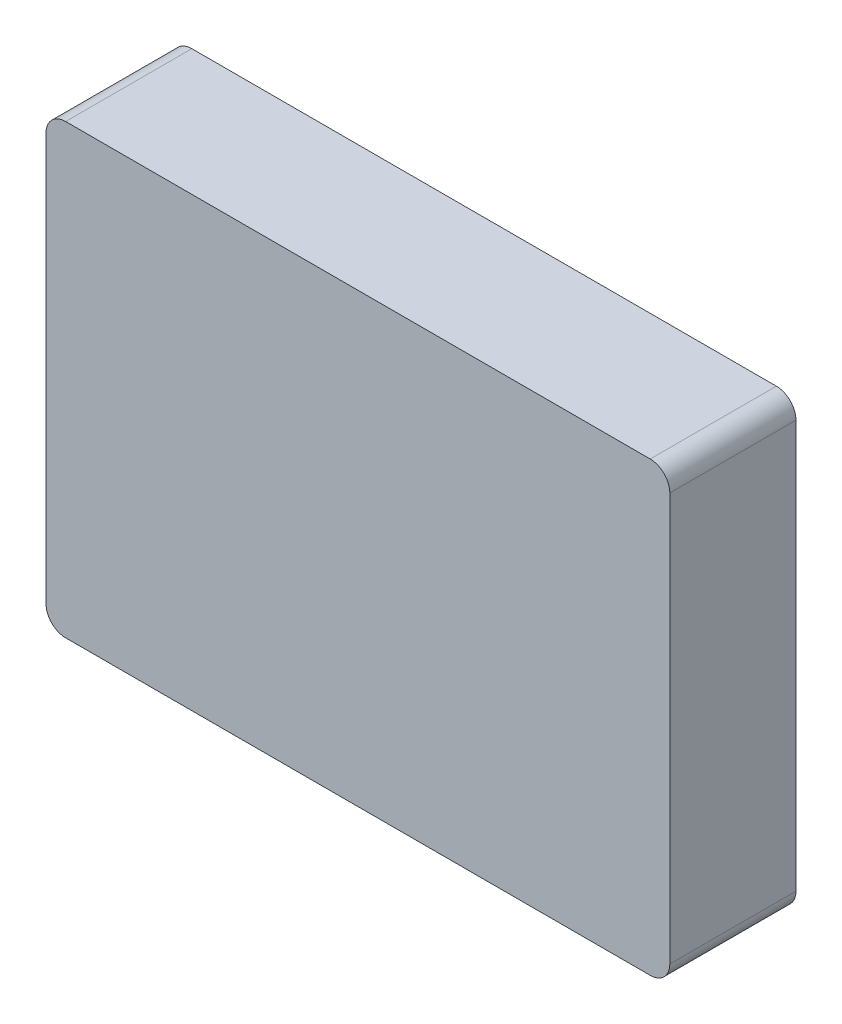
ISO-10303-21;
HEADER;
FILE_DESCRIPTION(('STEP AP214'),'2;1');
FILE_NAME('part.step','',(''),(''),'','','');
FILE_SCHEMA(('AUTOMOTIVE_DESIGN { 1 0 10303 214 1 1 1 1 }'));
ENDSEC;
DATA;
#1=APPLICATION_CONTEXT('core data for automotive mechanical design processes');
#2=APPLICATION_PROTOCOL_DEFINITION('international standard','automotive_design',2000,#1);
#3=PRODUCT_CONTEXT('',#1,'mechanical');
#4=PRODUCT('Part','Part','',(#3));
#5=PRODUCT_RELATED_PRODUCT_CATEGORY('part','',(#4));
#6=PRODUCT_DEFINITION_FORMATION('','',#4);
#7=PRODUCT_DEFINITION_CONTEXT('part definition',#1,'design');
#8=PRODUCT_DEFINITION('design','',#6,#7);
#9=PRODUCT_DEFINITION_SHAPE('','',#8);
#10=(LENGTH_UNIT() NAMED_UNIT(*) SI_UNIT(.MILLI.,.METRE.));
#11=(NAMED_UNIT(*) PLANE_ANGLE_UNIT() SI_UNIT($,.RADIAN.));
#12=(NAMED_UNIT(*) SI_UNIT($,.STERADIAN.) SOLID_ANGLE_UNIT());
#13=UNCERTAINTY_MEASURE_WITH_UNIT(LENGTH_MEASURE(1.E-05),#10,'distance_accuracy_value','');
#14=(GEOMETRIC_REPRESENTATION_CONTEXT(3) GLOBAL_UNCERTAINTY_ASSIGNED_CONTEXT((#13)) GLOBAL_UNIT_ASSIGNED_CONTEXT((#10,
#11,#12)) REPRESENTATION_CONTEXT('',''));
#15=CARTESIAN_POINT('',(0.,0.,0.));
#16=DIRECTION('',(0.,0.,1.));
#17=DIRECTION('',(1.,0.,0.));
#18=AXIS2_PLACEMENT_3D('',#15,#16,#17);
#19=CARTESIAN_POINT('',(-41.7,-29.1,18.));
#20=DIRECTION('',(0.,0.,-1.));
#21=DIRECTION('',(-1.,0.,0.));
#22=AXIS2_PLACEMENT_3D('',#19,#20,#21);
#23=CYLINDRICAL_SURFACE('',#22,2.8);
#24=CARTESIAN_POINT('',(-41.7,-29.1,0.));
#25=DIRECTION('',(0.,0.,1.));
#26=DIRECTION('',(-1.,0.,0.));
#27=AXIS2_PLACEMENT_3D('',#24,#25,#26);
#28=CIRCLE('',#27,2.8);
#29=CARTESIAN_POINT('',(-44.5,-29.1,0.));
#30=VERTEX_POINT('',#29);
#31=CARTESIAN_POINT('',(-41.7,-31.9,0.));
#32=VERTEX_POINT('',#31);
#33=EDGE_CURVE('E132',#30,#32,#28,.T.);
#34=ORIENTED_EDGE('',*,*,#33,.T.);
#35=DIRECTION('',(0.,0.,-1.));
#36=VECTOR('',#35,1.);
#37=CARTESIAN_POINT('',(-41.7,-31.9,18.));
#38=LINE('',#37,#36);
#39=CARTESIAN_POINT('',(-41.7,-31.9,18.));
#40=VERTEX_POINT('',#39);
#41=EDGE_CURVE('E11',#40,#32,#38,.T.);
#42=ORIENTED_EDGE('',*,*,#41,.F.);
#43=CARTESIAN_POINT('',(-41.7,-29.1,18.));
#44=DIRECTION('',(0.,0.,1.));
#45=DIRECTION('',(-1.,0.,0.));
#46=AXIS2_PLACEMENT_3D('',#43,#44,#45);
#47=CIRCLE('',#46,2.8);
#48=CARTESIAN_POINT('',(-44.5,-29.1,18.));
#49=VERTEX_POINT('',#48);
#50=EDGE_CURVE('E149',#49,#40,#47,.T.);
#51=ORIENTED_EDGE('',*,*,#50,.F.);
#52=DIRECTION('',(0.,0.,-1.));
#53=VECTOR('',#52,1.);
#54=CARTESIAN_POINT('',(-44.5,-29.1,18.));
#55=LINE('',#54,#53);
#56=EDGE_CURVE('E133',#49,#30,#55,.T.);
#57=ORIENTED_EDGE('',*,*,#56,.T.);
#58=EDGE_LOOP('',(#34,#42,#51,#57));
#59=FACE_BOUND('',#58,.T.);
#60=ADVANCED_FACE('F39',(#59),#23,.T.);
#61=CARTESIAN_POINT('',(-41.7,-31.9,18.));
#62=DIRECTION('',(0.,1.,0.));
#63=DIRECTION('',(0.,0.,1.));
#64=AXIS2_PLACEMENT_3D('',#61,#62,#63);
#65=PLANE('',#64);
#66=DIRECTION('',(1.,0.,0.));
#67=VECTOR('',#66,1.);
#68=CARTESIAN_POINT('',(-41.7,-31.9,0.));
#69=LINE('',#68,#67);
#70=CARTESIAN_POINT('',(41.7,-31.9,0.));
#71=VERTEX_POINT('',#70);
#72=EDGE_CURVE('E136',#32,#71,#69,.T.);
#73=ORIENTED_EDGE('',*,*,#72,.T.);
#74=DIRECTION('',(0.,0.,-1.));
#75=VECTOR('',#74,1.);
#76=CARTESIAN_POINT('',(41.7,-31.9,18.));
#77=LINE('',#76,#75);
#78=CARTESIAN_POINT('',(41.7,-31.9,18.));
#79=VERTEX_POINT('',#78);
#80=EDGE_CURVE('E50',#79,#71,#77,.T.);
#81=ORIENTED_EDGE('',*,*,#80,.F.);
#82=DIRECTION('',(1.,0.,0.));
#83=VECTOR('',#82,1.);
#84=CARTESIAN_POINT('',(-41.7,-31.9,18.));
#85=LINE('',#84,#83);
#86=EDGE_CURVE('E98',#40,#79,#85,.T.);
#87=ORIENTED_EDGE('',*,*,#86,.F.);
#88=ORIENTED_EDGE('',*,*,#41,.T.);
#89=EDGE_LOOP('',(#73,#81,#87,#88));
#90=FACE_BOUND('',#89,.T.);
#91=ADVANCED_FACE('F184',(#90),#65,.F.);
#92=CARTESIAN_POINT('',(41.7,-29.1,18.));
#93=DIRECTION('',(0.,0.,-1.));
#94=DIRECTION('',(-1.,0.,0.));
#95=AXIS2_PLACEMENT_3D('',#92,#93,#94);
#96=CYLINDRICAL_SURFACE('',#95,2.8);
#97=CARTESIAN_POINT('',(41.7,-29.1,0.));
#98=DIRECTION('',(0.,0.,1.));
#99=DIRECTION('',(1.,0.,0.));
#100=AXIS2_PLACEMENT_3D('',#97,#98,#99);
#101=CIRCLE('',#100,2.8);
#102=CARTESIAN_POINT('',(44.5,-29.1,0.));
#103=VERTEX_POINT('',#102);
#104=EDGE_CURVE('E139',#71,#103,#101,.T.);
#105=ORIENTED_EDGE('',*,*,#104,.T.);
#106=DIRECTION('',(0.,0.,-1.));
#107=VECTOR('',#106,1.);
#108=CARTESIAN_POINT('',(44.5,-29.1,18.));
#109=LINE('',#108,#107);
#110=CARTESIAN_POINT('',(44.5,-29.1,18.));
#111=VERTEX_POINT('',#110);
#112=EDGE_CURVE('E156',#111,#103,#109,.T.);
#113=ORIENTED_EDGE('',*,*,#112,.F.);
#114=CARTESIAN_POINT('',(41.7,-29.1,18.));
#115=DIRECTION('',(0.,0.,1.));
#116=DIRECTION('',(1.,0.,0.));
#117=AXIS2_PLACEMENT_3D('',#114,#115,#116);
#118=CIRCLE('',#117,2.8);
#119=EDGE_CURVE('E163',#79,#111,#118,.T.);
#120=ORIENTED_EDGE('',*,*,#119,.F.);
#121=ORIENTED_EDGE('',*,*,#80,.T.);
#122=EDGE_LOOP('',(#105,#113,#120,#121));
#123=FACE_BOUND('',#122,.T.);
#124=ADVANCED_FACE('F165',(#123),#96,.T.);
#125=CARTESIAN_POINT('',(44.5,-29.1,18.));
#126=DIRECTION('',(-1.,0.,0.));
#127=DIRECTION('',(0.,0.,1.));
#128=AXIS2_PLACEMENT_3D('',#125,#126,#127);
#129=PLANE('',#128);
#130=DIRECTION('',(0.,1.,0.));
#131=VECTOR('',#130,1.);
#132=CARTESIAN_POINT('',(44.5,-29.1,0.));
#133=LINE('',#132,#131);
#134=CARTESIAN_POINT('',(44.5,29.1,0.));
#135=VERTEX_POINT('',#134);
#136=EDGE_CURVE('E142',#103,#135,#133,.T.);
#137=ORIENTED_EDGE('',*,*,#136,.T.);
#138=DIRECTION('',(0.,0.,-1.));
#139=VECTOR('',#138,1.);
#140=CARTESIAN_POINT('',(44.5,29.1,18.));
#141=LINE('',#140,#139);
#142=CARTESIAN_POINT('',(44.5,29.1,18.));
#143=VERTEX_POINT('',#142);
#144=EDGE_CURVE('E153',#143,#135,#141,.T.);
#145=ORIENTED_EDGE('',*,*,#144,.F.);
#146=DIRECTION('',(0.,1.,0.));
#147=VECTOR('',#146,1.);
#148=CARTESIAN_POINT('',(44.5,-29.1,18.));
#149=LINE('',#148,#147);
#150=EDGE_CURVE('E178',#111,#143,#149,.T.);
#151=ORIENTED_EDGE('',*,*,#150,.F.);
#152=ORIENTED_EDGE('',*,*,#112,.T.);
#153=EDGE_LOOP('',(#137,#145,#151,#152));
#154=FACE_BOUND('',#153,.T.);
#155=ADVANCED_FACE('F175',(#154),#129,.F.);
#156=CARTESIAN_POINT('',(41.7,29.1,18.));
#157=DIRECTION('',(0.,0.,-1.));
#158=DIRECTION('',(-1.,0.,0.));
#159=AXIS2_PLACEMENT_3D('',#156,#157,#158);
#160=CYLINDRICAL_SURFACE('',#159,2.8);
#161=CARTESIAN_POINT('',(41.7,29.1,0.));
#162=DIRECTION('',(0.,0.,1.));
#163=DIRECTION('',(-1.,0.,0.));
#164=AXIS2_PLACEMENT_3D('',#161,#162,#163);
#165=CIRCLE('',#164,2.8);
#166=CARTESIAN_POINT('',(41.7,31.9,0.));
#167=VERTEX_POINT('',#166);
#168=EDGE_CURVE('E145',#135,#167,#165,.T.);
#169=ORIENTED_EDGE('',*,*,#168,.T.);
#170=DIRECTION('',(0.,0.,-1.));
#171=VECTOR('',#170,1.);
#172=CARTESIAN_POINT('',(41.7,31.9,18.));
#173=LINE('',#172,#171);
#174=CARTESIAN_POINT('',(41.7,31.9,18.));
#175=VERTEX_POINT('',#174);
#176=EDGE_CURVE('E127',#175,#167,#173,.T.);
#177=ORIENTED_EDGE('',*,*,#176,.F.);
#178=CARTESIAN_POINT('',(41.7,29.1,18.));
#179=DIRECTION('',(0.,0.,1.));
#180=DIRECTION('',(-1.,0.,0.));
#181=AXIS2_PLACEMENT_3D('',#178,#179,#180);
#182=CIRCLE('',#181,2.8);
#183=EDGE_CURVE('E120',#143,#175,#182,.T.);
#184=ORIENTED_EDGE('',*,*,#183,.F.);
#185=ORIENTED_EDGE('',*,*,#144,.T.);
#186=EDGE_LOOP('',(#169,#177,#184,#185));
#187=FACE_BOUND('',#186,.T.);
#188=ADVANCED_FACE('F172',(#187),#160,.T.);
#189=CARTESIAN_POINT('',(-41.7,31.9,18.));
#190=DIRECTION('',(0.,-1.,0.));
#191=DIRECTION('',(0.,0.,-1.));
#192=AXIS2_PLACEMENT_3D('',#189,#190,#191);
#193=PLANE('',#192);
#194=DIRECTION('',(-1.,0.,0.));
#195=VECTOR('',#194,1.);
#196=CARTESIAN_POINT('',(-41.7,31.9,0.));
#197=LINE('',#196,#195);
#198=CARTESIAN_POINT('',(-41.7,31.9,0.));
#199=VERTEX_POINT('',#198);
#200=EDGE_CURVE('E124',#167,#199,#197,.T.);
#201=ORIENTED_EDGE('',*,*,#200,.T.);
#202=DIRECTION('',(0.,0.,-1.));
#203=VECTOR('',#202,1.);
#204=CARTESIAN_POINT('',(-41.7,31.9,18.));
#205=LINE('',#204,#203);
#206=CARTESIAN_POINT('',(-41.7,31.9,18.));
#207=VERTEX_POINT('',#206);
#208=EDGE_CURVE('E125',#207,#199,#205,.T.);
#209=ORIENTED_EDGE('',*,*,#208,.F.);
#210=DIRECTION('',(-1.,0.,0.));
#211=VECTOR('',#210,1.);
#212=CARTESIAN_POINT('',(-41.7,31.9,18.));
#213=LINE('',#212,#211);
#214=EDGE_CURVE('E112',#175,#207,#213,.T.);
#215=ORIENTED_EDGE('',*,*,#214,.F.);
#216=ORIENTED_EDGE('',*,*,#176,.T.);
#217=EDGE_LOOP('',(#201,#209,#215,#216));
#218=FACE_BOUND('',#217,.T.);
#219=ADVANCED_FACE('F121',(#218),#193,.F.);
#220=CARTESIAN_POINT('',(-41.7,29.1,18.));
#221=DIRECTION('',(0.,0.,-1.));
#222=DIRECTION('',(-1.,0.,0.));
#223=AXIS2_PLACEMENT_3D('',#220,#221,#222);
#224=CYLINDRICAL_SURFACE('',#223,2.8);
#225=CARTESIAN_POINT('',(-41.7,29.1,0.));
#226=DIRECTION('',(0.,0.,1.));
#227=DIRECTION('',(-1.,0.,0.));
#228=AXIS2_PLACEMENT_3D('',#225,#226,#227);
#229=CIRCLE('',#228,2.8);
#230=CARTESIAN_POINT('',(-44.5,29.1,0.));
#231=VERTEX_POINT('',#230);
#232=EDGE_CURVE('E82',#199,#231,#229,.T.);
#233=ORIENTED_EDGE('',*,*,#232,.T.);
#234=DIRECTION('',(0.,0.,-1.));
#235=VECTOR('',#234,1.);
#236=CARTESIAN_POINT('',(-44.5,29.1,18.));
#237=LINE('',#236,#235);
#238=CARTESIAN_POINT('',(-44.5,29.1,18.));
#239=VERTEX_POINT('',#238);
#240=EDGE_CURVE('E130',#239,#231,#237,.T.);
#241=ORIENTED_EDGE('',*,*,#240,.F.);
#242=CARTESIAN_POINT('',(-41.7,29.1,18.));
#243=DIRECTION('',(0.,0.,1.));
#244=DIRECTION('',(-1.,0.,0.));
#245=AXIS2_PLACEMENT_3D('',#242,#243,#244);
#246=CIRCLE('',#245,2.8);
#247=EDGE_CURVE('E113',#207,#239,#246,.T.);
#248=ORIENTED_EDGE('',*,*,#247,.F.);
#249=ORIENTED_EDGE('',*,*,#208,.T.);
#250=EDGE_LOOP('',(#233,#241,#248,#249));
#251=FACE_BOUND('',#250,.T.);
#252=ADVANCED_FACE('F129',(#251),#224,.T.);
#253=CARTESIAN_POINT('',(-44.5,-29.1,18.));
#254=DIRECTION('',(1.,0.,0.));
#255=DIRECTION('',(0.,0.,-1.));
#256=AXIS2_PLACEMENT_3D('',#253,#254,#255);
#257=PLANE('',#256);
#258=DIRECTION('',(0.,-1.,0.));
#259=VECTOR('',#258,1.);
#260=CARTESIAN_POINT('',(-44.5,-29.1,0.));
#261=LINE('',#260,#259);
#262=EDGE_CURVE('E89',#231,#30,#261,.T.);
#263=ORIENTED_EDGE('',*,*,#262,.T.);
#264=ORIENTED_EDGE('',*,*,#56,.F.);
#265=DIRECTION('',(0.,-1.,0.));
#266=VECTOR('',#265,1.);
#267=CARTESIAN_POINT('',(-44.5,-29.1,18.));
#268=LINE('',#267,#266);
#269=EDGE_CURVE('E54',#239,#49,#268,.T.);
#270=ORIENTED_EDGE('',*,*,#269,.F.);
#271=ORIENTED_EDGE('',*,*,#240,.T.);
#272=EDGE_LOOP('',(#263,#264,#270,#271));
#273=FACE_BOUND('',#272,.T.);
#274=ADVANCED_FACE('F199',(#273),#257,.F.);
#275=CARTESIAN_POINT('',(-41.7,-29.1,18.));
#276=DIRECTION('',(0.,0.,-1.));
#277=DIRECTION('',(-1.,0.,0.));
#278=AXIS2_PLACEMENT_3D('',#275,#276,#277);
#279=PLANE('',#278);
#280=ORIENTED_EDGE('',*,*,#50,.T.);
#281=ORIENTED_EDGE('',*,*,#86,.T.);
#282=ORIENTED_EDGE('',*,*,#119,.T.);
#283=ORIENTED_EDGE('',*,*,#150,.T.);
#284=ORIENTED_EDGE('',*,*,#183,.T.);
#285=ORIENTED_EDGE('',*,*,#214,.T.);
#286=ORIENTED_EDGE('',*,*,#247,.T.);
#287=ORIENTED_EDGE('',*,*,#269,.T.);
#288=EDGE_LOOP('',(#280,#281,#282,#283,#284,#285,#286,#287));
#289=FACE_BOUND('',#288,.T.);
#290=ADVANCED_FACE('F114',(#289),#279,.F.);
#291=CARTESIAN_POINT('',(-41.7,-29.1,0.));
#292=DIRECTION('',(0.,0.,-1.));
#293=DIRECTION('',(-1.,0.,0.));
#294=AXIS2_PLACEMENT_3D('',#291,#292,#293);
#295=PLANE('',#294);
#296=ORIENTED_EDGE('',*,*,#33,.F.);
#297=ORIENTED_EDGE('',*,*,#262,.F.);
#298=ORIENTED_EDGE('',*,*,#232,.F.);
#299=ORIENTED_EDGE('',*,*,#200,.F.);
#300=ORIENTED_EDGE('',*,*,#168,.F.);
#301=ORIENTED_EDGE('',*,*,#136,.F.);
#302=ORIENTED_EDGE('',*,*,#104,.F.);
#303=ORIENTED_EDGE('',*,*,#72,.F.);
#304=EDGE_LOOP('',(#296,#297,#298,#299,#300,#301,#302,#303));
#305=FACE_BOUND('',#304,.T.);
#306=ADVANCED_FACE('F169',(#305),#295,.T.);
#307=CLOSED_SHELL('',(#60,#91,#124,#155,#188,#219,#252,#274,#290,#306));
#308=MANIFOLD_SOLID_BREP('B2',#307);
#309=ADVANCED_BREP_SHAPE_REPRESENTATION('',(#18,#308),#14);
#310=SHAPE_DEFINITION_REPRESENTATION(#9,#309);
ENDSEC;
END-ISO-10303-21;
